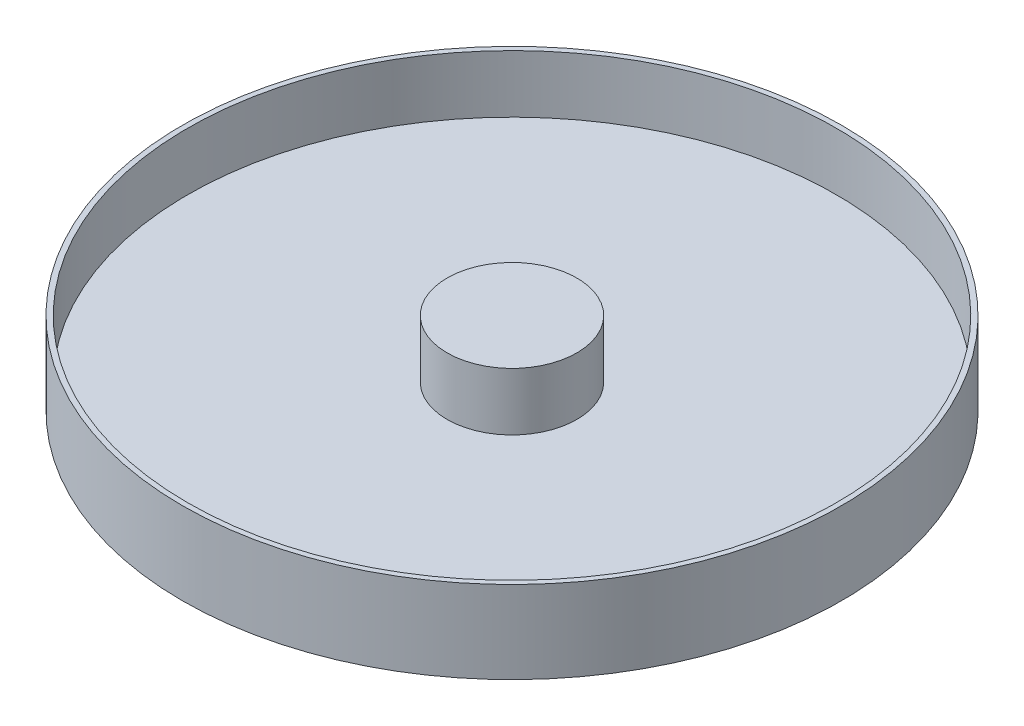
ISO-10303-21;
HEADER;
FILE_DESCRIPTION(('STEP AP214'),'2;1');
FILE_NAME('part.step','',(''),(''),'','','');
FILE_SCHEMA(('AUTOMOTIVE_DESIGN { 1 0 10303 214 1 1 1 1 }'));
ENDSEC;
DATA;
#1=APPLICATION_CONTEXT('core data for automotive mechanical design processes');
#2=APPLICATION_PROTOCOL_DEFINITION('international standard','automotive_design',2000,#1);
#3=PRODUCT_CONTEXT('',#1,'mechanical');
#4=PRODUCT('Part','Part','',(#3));
#5=PRODUCT_RELATED_PRODUCT_CATEGORY('part','',(#4));
#6=PRODUCT_DEFINITION_FORMATION('','',#4);
#7=PRODUCT_DEFINITION_CONTEXT('part definition',#1,'design');
#8=PRODUCT_DEFINITION('design','',#6,#7);
#9=PRODUCT_DEFINITION_SHAPE('','',#8);
#10=(LENGTH_UNIT() NAMED_UNIT(*) SI_UNIT(.MILLI.,.METRE.));
#11=(NAMED_UNIT(*) PLANE_ANGLE_UNIT() SI_UNIT($,.RADIAN.));
#12=(NAMED_UNIT(*) SI_UNIT($,.STERADIAN.) SOLID_ANGLE_UNIT());
#13=UNCERTAINTY_MEASURE_WITH_UNIT(LENGTH_MEASURE(1.E-05),#10,'distance_accuracy_value','');
#14=(GEOMETRIC_REPRESENTATION_CONTEXT(3) GLOBAL_UNCERTAINTY_ASSIGNED_CONTEXT((#13)) GLOBAL_UNIT_ASSIGNED_CONTEXT((#10,
#11,#12)) REPRESENTATION_CONTEXT('',''));
#15=CARTESIAN_POINT('',(0.,0.,0.));
#16=DIRECTION('',(0.,0.,1.));
#17=DIRECTION('',(1.,0.,0.));
#18=AXIS2_PLACEMENT_3D('',#15,#16,#17);
#19=CARTESIAN_POINT('',(0.,20.,0.));
#20=DIRECTION('',(0.,-1.,0.));
#21=DIRECTION('',(0.,0.,-1.));
#22=AXIS2_PLACEMENT_3D('',#19,#20,#21);
#23=CYLINDRICAL_SURFACE('',#22,78.75);
#24=CARTESIAN_POINT('',(0.,6.,0.));
#25=DIRECTION('',(0.,1.,0.));
#26=DIRECTION('',(0.,0.,1.));
#27=AXIS2_PLACEMENT_3D('',#24,#25,#26);
#28=CIRCLE('',#27,78.75);
#29=CARTESIAN_POINT('',(0.,6.,78.75));
#30=VERTEX_POINT('',#29);
#31=EDGE_CURVE('E10',#30,#30,#28,.T.);
#32=ORIENTED_EDGE('',*,*,#31,.F.);
#33=EDGE_LOOP('',(#32));
#34=FACE_BOUND('',#33,.T.);
#35=CARTESIAN_POINT('',(0.,20.,0.));
#36=DIRECTION('',(0.,1.,0.));
#37=DIRECTION('',(0.,0.,1.));
#38=AXIS2_PLACEMENT_3D('',#35,#36,#37);
#39=CIRCLE('',#38,78.75);
#40=CARTESIAN_POINT('',(0.,20.,78.75));
#41=VERTEX_POINT('',#40);
#42=EDGE_CURVE('E41',#41,#41,#39,.T.);
#43=ORIENTED_EDGE('',*,*,#42,.T.);
#44=EDGE_LOOP('',(#43));
#45=FACE_BOUND('',#44,.T.);
#46=ADVANCED_FACE('F31',(#34,#45),#23,.F.);
#47=CARTESIAN_POINT('',(0.,20.,0.));
#48=DIRECTION('',(0.,-1.,0.));
#49=DIRECTION('',(0.,0.,-1.));
#50=AXIS2_PLACEMENT_3D('',#47,#48,#49);
#51=CYLINDRICAL_SURFACE('',#50,80.);
#52=CARTESIAN_POINT('',(0.,20.,0.));
#53=DIRECTION('',(0.,1.,0.));
#54=DIRECTION('',(0.,0.,1.));
#55=AXIS2_PLACEMENT_3D('',#52,#53,#54);
#56=CIRCLE('',#55,80.);
#57=CARTESIAN_POINT('',(0.,20.,80.));
#58=VERTEX_POINT('',#57);
#59=EDGE_CURVE('E37',#58,#58,#56,.T.);
#60=ORIENTED_EDGE('',*,*,#59,.F.);
#61=EDGE_LOOP('',(#60));
#62=FACE_BOUND('',#61,.T.);
#63=CARTESIAN_POINT('',(0.,0.,0.));
#64=DIRECTION('',(0.,1.,0.));
#65=DIRECTION('',(0.,0.,1.));
#66=AXIS2_PLACEMENT_3D('',#63,#64,#65);
#67=CIRCLE('',#66,80.);
#68=CARTESIAN_POINT('',(0.,0.,80.));
#69=VERTEX_POINT('',#68);
#70=EDGE_CURVE('E46',#69,#69,#67,.T.);
#71=ORIENTED_EDGE('',*,*,#70,.T.);
#72=EDGE_LOOP('',(#71));
#73=FACE_BOUND('',#72,.T.);
#74=ADVANCED_FACE('F73',(#62,#73),#51,.T.);
#75=CARTESIAN_POINT('',(0.,20.,0.));
#76=DIRECTION('',(0.,1.,0.));
#77=DIRECTION('',(0.,0.,1.));
#78=AXIS2_PLACEMENT_3D('',#75,#76,#77);
#79=PLANE('',#78);
#80=ORIENTED_EDGE('',*,*,#42,.F.);
#81=EDGE_LOOP('',(#80));
#82=FACE_BOUND('',#81,.T.);
#83=ORIENTED_EDGE('',*,*,#59,.T.);
#84=EDGE_LOOP('',(#83));
#85=FACE_BOUND('',#84,.T.);
#86=ADVANCED_FACE('F78',(#82,#85),#79,.T.);
#87=CARTESIAN_POINT('',(0.,0.,0.));
#88=DIRECTION('',(0.,1.,0.));
#89=DIRECTION('',(0.,0.,1.));
#90=AXIS2_PLACEMENT_3D('',#87,#88,#89);
#91=PLANE('',#90);
#92=ORIENTED_EDGE('',*,*,#70,.F.);
#93=EDGE_LOOP('',(#92));
#94=FACE_BOUND('',#93,.T.);
#95=ADVANCED_FACE('F84',(#94),#91,.F.);
#96=CARTESIAN_POINT('',(0.,6.,0.));
#97=DIRECTION('',(0.,1.,0.));
#98=DIRECTION('',(0.,0.,1.));
#99=AXIS2_PLACEMENT_3D('',#96,#97,#98);
#100=PLANE('',#99);
#101=CARTESIAN_POINT('',(0.,6.,0.));
#102=DIRECTION('',(0.,1.,0.));
#103=DIRECTION('',(0.,0.,1.));
#104=AXIS2_PLACEMENT_3D('',#101,#102,#103);
#105=CIRCLE('',#104,15.75);
#106=CARTESIAN_POINT('',(0.,6.,15.75));
#107=VERTEX_POINT('',#106);
#108=EDGE_CURVE('E50',#107,#107,#105,.T.);
#109=ORIENTED_EDGE('',*,*,#108,.F.);
#110=EDGE_LOOP('',(#109));
#111=FACE_BOUND('',#110,.T.);
#112=ORIENTED_EDGE('',*,*,#31,.T.);
#113=EDGE_LOOP('',(#112));
#114=FACE_BOUND('',#113,.T.);
#115=ADVANCED_FACE('F69',(#111,#114),#100,.T.);
#116=CARTESIAN_POINT('',(0.,20.,0.));
#117=DIRECTION('',(0.,1.,0.));
#118=DIRECTION('',(0.,0.,1.));
#119=AXIS2_PLACEMENT_3D('',#116,#117,#118);
#120=PLANE('',#119);
#121=CARTESIAN_POINT('',(0.,20.,0.));
#122=DIRECTION('',(0.,1.,0.));
#123=DIRECTION('',(0.,0.,1.));
#124=AXIS2_PLACEMENT_3D('',#121,#122,#123);
#125=CIRCLE('',#124,15.75);
#126=CARTESIAN_POINT('',(0.,20.,15.75));
#127=VERTEX_POINT('',#126);
#128=EDGE_CURVE('E54',#127,#127,#125,.T.);
#129=ORIENTED_EDGE('',*,*,#128,.T.);
#130=EDGE_LOOP('',(#129));
#131=FACE_BOUND('',#130,.T.);
#132=ADVANCED_FACE('F61',(#131),#120,.T.);
#133=CARTESIAN_POINT('',(0.,20.,0.));
#134=DIRECTION('',(0.,-1.,0.));
#135=DIRECTION('',(0.,0.,-1.));
#136=AXIS2_PLACEMENT_3D('',#133,#134,#135);
#137=CYLINDRICAL_SURFACE('',#136,15.75);
#138=ORIENTED_EDGE('',*,*,#108,.T.);
#139=EDGE_LOOP('',(#138));
#140=FACE_BOUND('',#139,.T.);
#141=ORIENTED_EDGE('',*,*,#128,.F.);
#142=EDGE_LOOP('',(#141));
#143=FACE_BOUND('',#142,.T.);
#144=ADVANCED_FACE('F63',(#140,#143),#137,.T.);
#145=CLOSED_SHELL('',(#46,#74,#86,#95,#115,#132,#144));
#146=MANIFOLD_SOLID_BREP('B2',#145);
#147=ADVANCED_BREP_SHAPE_REPRESENTATION('',(#18,#146),#14);
#148=SHAPE_DEFINITION_REPRESENTATION(#9,#147);
ENDSEC;
END-ISO-10303-21;
